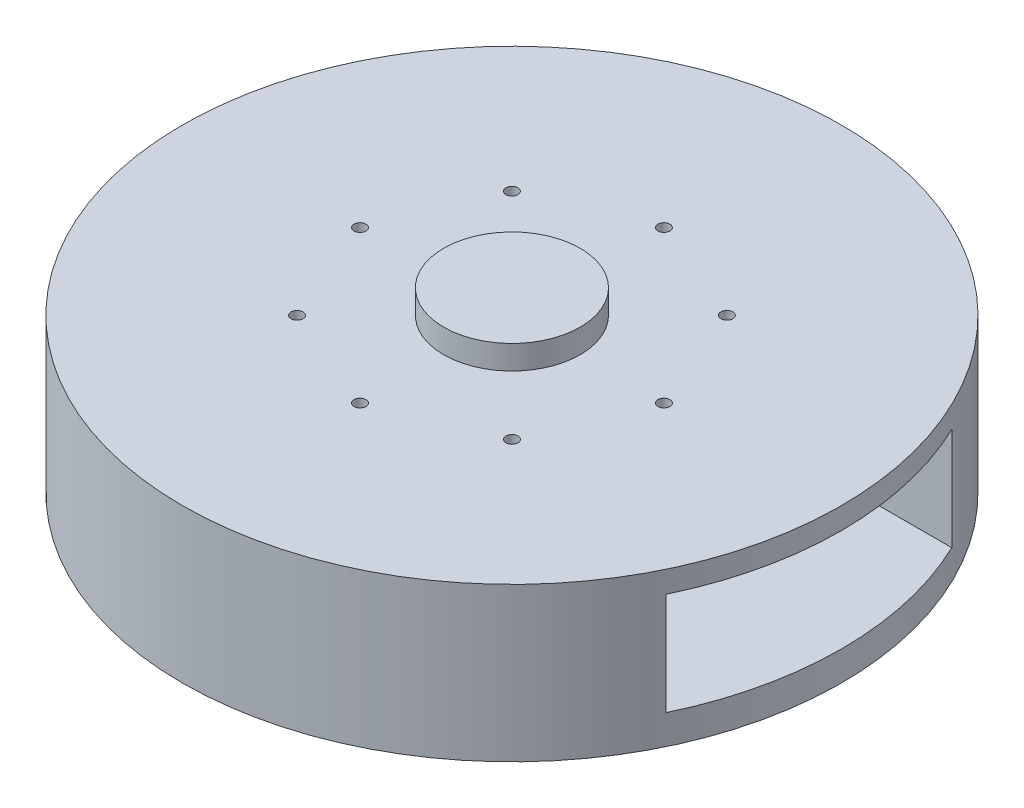
ISO-10303-21;
HEADER;
FILE_DESCRIPTION(('STEP AP214'),'2;1');
FILE_NAME('part.step','',(''),(''),'','','');
FILE_SCHEMA(('AUTOMOTIVE_DESIGN { 1 0 10303 214 1 1 1 1 }'));
ENDSEC;
DATA;
#1=APPLICATION_CONTEXT('core data for automotive mechanical design processes');
#2=APPLICATION_PROTOCOL_DEFINITION('international standard','automotive_design',2000,#1);
#3=PRODUCT_CONTEXT('',#1,'mechanical');
#4=PRODUCT('Part','Part','',(#3));
#5=PRODUCT_RELATED_PRODUCT_CATEGORY('part','',(#4));
#6=PRODUCT_DEFINITION_FORMATION('','',#4);
#7=PRODUCT_DEFINITION_CONTEXT('part definition',#1,'design');
#8=PRODUCT_DEFINITION('design','',#6,#7);
#9=PRODUCT_DEFINITION_SHAPE('','',#8);
#10=(LENGTH_UNIT() NAMED_UNIT(*) SI_UNIT(.MILLI.,.METRE.));
#11=(NAMED_UNIT(*) PLANE_ANGLE_UNIT() SI_UNIT($,.RADIAN.));
#12=(NAMED_UNIT(*) SI_UNIT($,.STERADIAN.) SOLID_ANGLE_UNIT());
#13=UNCERTAINTY_MEASURE_WITH_UNIT(LENGTH_MEASURE(1.E-05),#10,'distance_accuracy_value','');
#14=(GEOMETRIC_REPRESENTATION_CONTEXT(3) GLOBAL_UNCERTAINTY_ASSIGNED_CONTEXT((#13)) GLOBAL_UNIT_ASSIGNED_CONTEXT((#10,
#11,#12)) REPRESENTATION_CONTEXT('',''));
#15=CARTESIAN_POINT('',(0.,0.,0.));
#16=DIRECTION('',(0.,0.,1.));
#17=DIRECTION('',(1.,0.,0.));
#18=AXIS2_PLACEMENT_3D('',#15,#16,#17);
#19=CARTESIAN_POINT('',(0.,45.,0.));
#20=DIRECTION('',(0.,-1.,0.));
#21=DIRECTION('',(0.,0.,-1.));
#22=AXIS2_PLACEMENT_3D('',#19,#20,#21);
#23=CYLINDRICAL_SURFACE('',#22,96.5);
#24=CARTESIAN_POINT('',(0.,8.6519840390032,0.));
#25=DIRECTION('',(0.,-1.,0.));
#26=DIRECTION('',(0.,0.,-1.));
#27=AXIS2_PLACEMENT_3D('',#24,#25,#26);
#28=CIRCLE('',#27,96.5);
#29=CARTESIAN_POINT('',(86.9721419574417,8.65198403900322,-41.8102442391169));
#30=VERTEX_POINT('',#29);
#31=CARTESIAN_POINT('',(86.9721419574417,8.65198403900318,41.8102442391169));
#32=VERTEX_POINT('',#31);
#33=EDGE_CURVE('E110',#30,#32,#28,.T.);
#34=ORIENTED_EDGE('',*,*,#33,.T.);
#35=DIRECTION('',(0.,-1.,0.));
#36=VECTOR('',#35,1.);
#37=CARTESIAN_POINT('',(86.9721419574417,45.,41.8102442391169));
#38=LINE('',#37,#36);
#39=CARTESIAN_POINT('',(86.9721419574417,38.6519840390032,41.8102442391169));
#40=VERTEX_POINT('',#39);
#41=EDGE_CURVE('E126',#32,#40,#38,.F.);
#42=ORIENTED_EDGE('',*,*,#41,.T.);
#43=CARTESIAN_POINT('',(0.,38.6519840390032,0.));
#44=DIRECTION('',(0.,1.,0.));
#45=DIRECTION('',(0.,0.,1.));
#46=AXIS2_PLACEMENT_3D('',#43,#44,#45);
#47=CIRCLE('',#46,96.5);
#48=CARTESIAN_POINT('',(86.9721419574417,38.6519840390032,-41.8102442391169));
#49=VERTEX_POINT('',#48);
#50=EDGE_CURVE('E132',#40,#49,#47,.T.);
#51=ORIENTED_EDGE('',*,*,#50,.T.);
#52=DIRECTION('',(0.,-1.,0.));
#53=VECTOR('',#52,1.);
#54=CARTESIAN_POINT('',(86.9721419574417,45.,-41.8102442391169));
#55=LINE('',#54,#53);
#56=EDGE_CURVE('E178',#49,#30,#55,.T.);
#57=ORIENTED_EDGE('',*,*,#56,.T.);
#58=EDGE_LOOP('',(#34,#42,#51,#57));
#59=FACE_BOUND('',#58,.T.);
#60=CARTESIAN_POINT('',(-86.9721419574417,38.6519840390032,-41.8102442391169));
#61=VERTEX_POINT('',#60);
#62=CARTESIAN_POINT('',(-86.9721419574417,38.6519840390032,41.8102442391169));
#63=VERTEX_POINT('',#62);
#64=EDGE_CURVE('E124',#61,#63,#47,.T.);
#65=ORIENTED_EDGE('',*,*,#64,.T.);
#66=DIRECTION('',(0.,-1.,0.));
#67=VECTOR('',#66,1.);
#68=CARTESIAN_POINT('',(-86.9721419574417,45.,41.8102442391169));
#69=LINE('',#68,#67);
#70=CARTESIAN_POINT('',(-86.9721419574417,8.65198403900318,41.8102442391169));
#71=VERTEX_POINT('',#70);
#72=EDGE_CURVE('E116',#63,#71,#69,.T.);
#73=ORIENTED_EDGE('',*,*,#72,.T.);
#74=CARTESIAN_POINT('',(-86.9721419574417,8.65198403900322,-41.8102442391169));
#75=VERTEX_POINT('',#74);
#76=EDGE_CURVE('E102',#71,#75,#28,.T.);
#77=ORIENTED_EDGE('',*,*,#76,.T.);
#78=DIRECTION('',(0.,-1.,0.));
#79=VECTOR('',#78,1.);
#80=CARTESIAN_POINT('',(-86.9721419574417,45.,-41.8102442391169));
#81=LINE('',#80,#79);
#82=EDGE_CURVE('E167',#75,#61,#81,.F.);
#83=ORIENTED_EDGE('',*,*,#82,.T.);
#84=EDGE_LOOP('',(#65,#73,#77,#83));
#85=FACE_BOUND('',#84,.T.);
#86=CARTESIAN_POINT('',(0.,45.,0.));
#87=DIRECTION('',(0.,1.,0.));
#88=DIRECTION('',(0.,0.,1.));
#89=AXIS2_PLACEMENT_3D('',#86,#87,#88);
#90=CIRCLE('',#89,96.5);
#91=CARTESIAN_POINT('',(0.,45.,96.5));
#92=VERTEX_POINT('',#91);
#93=EDGE_CURVE('E139',#92,#92,#90,.T.);
#94=ORIENTED_EDGE('',*,*,#93,.F.);
#95=EDGE_LOOP('',(#94));
#96=FACE_BOUND('',#95,.T.);
#97=CARTESIAN_POINT('',(0.,0.,0.));
#98=DIRECTION('',(0.,1.,0.));
#99=DIRECTION('',(0.,0.,1.));
#100=AXIS2_PLACEMENT_3D('',#97,#98,#99);
#101=CIRCLE('',#100,96.5);
#102=CARTESIAN_POINT('',(0.,0.,96.5));
#103=VERTEX_POINT('',#102);
#104=EDGE_CURVE('E137',#103,#103,#101,.T.);
#105=ORIENTED_EDGE('',*,*,#104,.T.);
#106=EDGE_LOOP('',(#105));
#107=FACE_BOUND('',#106,.T.);
#108=ADVANCED_FACE('F39',(#59,#85,#96,#107),#23,.T.);
#109=CARTESIAN_POINT('',(0.,45.,0.));
#110=DIRECTION('',(0.,1.,0.));
#111=DIRECTION('',(0.,0.,1.));
#112=AXIS2_PLACEMENT_3D('',#109,#110,#111);
#113=PLANE('',#112);
#114=CARTESIAN_POINT('',(0.,45.,44.5));
#115=DIRECTION('',(0.,1.,0.));
#116=DIRECTION('',(0.,0.,1.));
#117=AXIS2_PLACEMENT_3D('',#114,#115,#116);
#118=CIRCLE('',#117,1.75);
#119=CARTESIAN_POINT('',(0.,45.,46.25));
#120=VERTEX_POINT('',#119);
#121=EDGE_CURVE('E194',#120,#120,#118,.T.);
#122=ORIENTED_EDGE('',*,*,#121,.F.);
#123=EDGE_LOOP('',(#122));
#124=FACE_BOUND('',#123,.T.);
#125=CARTESIAN_POINT('',(31.4662517628014,45.,31.4662517628013));
#126=DIRECTION('',(0.,1.,0.));
#127=DIRECTION('',(0.,0.,1.));
#128=AXIS2_PLACEMENT_3D('',#125,#126,#127);
#129=CIRCLE('',#128,1.75);
#130=CARTESIAN_POINT('',(31.4662517628014,45.,33.2162517628013));
#131=VERTEX_POINT('',#130);
#132=EDGE_CURVE('E197',#131,#131,#129,.T.);
#133=ORIENTED_EDGE('',*,*,#132,.F.);
#134=EDGE_LOOP('',(#133));
#135=FACE_BOUND('',#134,.T.);
#136=CARTESIAN_POINT('',(44.5,45.,-1.55370919578519E-13));
#137=DIRECTION('',(0.,1.,0.));
#138=DIRECTION('',(0.,0.,1.));
#139=AXIS2_PLACEMENT_3D('',#136,#137,#138);
#140=CIRCLE('',#139,1.75);
#141=CARTESIAN_POINT('',(44.5,45.,1.74999999999984));
#142=VERTEX_POINT('',#141);
#143=EDGE_CURVE('E200',#142,#142,#140,.T.);
#144=ORIENTED_EDGE('',*,*,#143,.F.);
#145=EDGE_LOOP('',(#144));
#146=FACE_BOUND('',#145,.T.);
#147=CARTESIAN_POINT('',(31.4662517628012,45.,-31.4662517628015));
#148=DIRECTION('',(0.,1.,0.));
#149=DIRECTION('',(0.,0.,1.));
#150=AXIS2_PLACEMENT_3D('',#147,#148,#149);
#151=CIRCLE('',#150,1.75);
#152=CARTESIAN_POINT('',(31.4662517628012,45.,-29.7162517628015));
#153=VERTEX_POINT('',#152);
#154=EDGE_CURVE('E203',#153,#153,#151,.T.);
#155=ORIENTED_EDGE('',*,*,#154,.F.);
#156=EDGE_LOOP('',(#155));
#157=FACE_BOUND('',#156,.T.);
#158=CARTESIAN_POINT('',(-3.10741839157039E-13,45.,-44.5));
#159=DIRECTION('',(0.,1.,0.));
#160=DIRECTION('',(0.,0.,1.));
#161=AXIS2_PLACEMENT_3D('',#158,#159,#160);
#162=CIRCLE('',#161,1.75);
#163=CARTESIAN_POINT('',(-3.10741839157039E-13,45.,-42.75));
#164=VERTEX_POINT('',#163);
#165=EDGE_CURVE('E206',#164,#164,#162,.T.);
#166=ORIENTED_EDGE('',*,*,#165,.F.);
#167=EDGE_LOOP('',(#166));
#168=FACE_BOUND('',#167,.T.);
#169=CARTESIAN_POINT('',(-31.4662517628016,45.,-31.4662517628011));
#170=DIRECTION('',(0.,1.,0.));
#171=DIRECTION('',(0.,0.,1.));
#172=AXIS2_PLACEMENT_3D('',#169,#170,#171);
#173=CIRCLE('',#172,1.75);
#174=CARTESIAN_POINT('',(-31.4662517628016,45.,-29.7162517628011));
#175=VERTEX_POINT('',#174);
#176=EDGE_CURVE('E209',#175,#175,#173,.T.);
#177=ORIENTED_EDGE('',*,*,#176,.F.);
#178=EDGE_LOOP('',(#177));
#179=FACE_BOUND('',#178,.T.);
#180=CARTESIAN_POINT('',(-44.5,45.,4.66112758735558E-13));
#181=DIRECTION('',(0.,1.,0.));
#182=DIRECTION('',(0.,0.,1.));
#183=AXIS2_PLACEMENT_3D('',#180,#181,#182);
#184=CIRCLE('',#183,1.75);
#185=CARTESIAN_POINT('',(-44.5,45.,1.75000000000047));
#186=VERTEX_POINT('',#185);
#187=EDGE_CURVE('E212',#186,#186,#184,.T.);
#188=ORIENTED_EDGE('',*,*,#187,.F.);
#189=EDGE_LOOP('',(#188));
#190=FACE_BOUND('',#189,.T.);
#191=CARTESIAN_POINT('',(-31.466251762801,45.,31.4662517628018));
#192=DIRECTION('',(0.,1.,0.));
#193=DIRECTION('',(0.,0.,1.));
#194=AXIS2_PLACEMENT_3D('',#191,#192,#193);
#195=CIRCLE('',#194,1.75);
#196=CARTESIAN_POINT('',(-31.466251762801,45.,33.2162517628018));
#197=VERTEX_POINT('',#196);
#198=EDGE_CURVE('E215',#197,#197,#195,.T.);
#199=ORIENTED_EDGE('',*,*,#198,.F.);
#200=EDGE_LOOP('',(#199));
#201=FACE_BOUND('',#200,.T.);
#202=CARTESIAN_POINT('',(0.,45.,0.));
#203=DIRECTION('',(0.,1.,0.));
#204=DIRECTION('',(0.,0.,1.));
#205=AXIS2_PLACEMENT_3D('',#202,#203,#204);
#206=CIRCLE('',#205,20.);
#207=CARTESIAN_POINT('',(0.,45.,20.));
#208=VERTEX_POINT('',#207);
#209=EDGE_CURVE('E11',#208,#208,#206,.T.);
#210=ORIENTED_EDGE('',*,*,#209,.F.);
#211=EDGE_LOOP('',(#210));
#212=FACE_BOUND('',#211,.T.);
#213=ORIENTED_EDGE('',*,*,#93,.T.);
#214=EDGE_LOOP('',(#213));
#215=FACE_BOUND('',#214,.T.);
#216=ADVANCED_FACE('F274',(#124,#135,#146,#157,#168,#179,#190,#201,#212,#215),#113,.T.);
#217=CARTESIAN_POINT('',(0.,0.,0.));
#218=DIRECTION('',(0.,1.,0.));
#219=DIRECTION('',(0.,0.,1.));
#220=AXIS2_PLACEMENT_3D('',#217,#218,#219);
#221=PLANE('',#220);
#222=CARTESIAN_POINT('',(0.,0.,0.));
#223=DIRECTION('',(0.,-1.,0.));
#224=DIRECTION('',(0.,0.,-1.));
#225=AXIS2_PLACEMENT_3D('',#222,#223,#224);
#226=CIRCLE('',#225,48.25);
#227=CARTESIAN_POINT('',(0.,0.,-48.25));
#228=VERTEX_POINT('',#227);
#229=EDGE_CURVE('E125',#228,#228,#226,.T.);
#230=ORIENTED_EDGE('',*,*,#229,.F.);
#231=EDGE_LOOP('',(#230));
#232=FACE_BOUND('',#231,.T.);
#233=ORIENTED_EDGE('',*,*,#104,.F.);
#234=EDGE_LOOP('',(#233));
#235=FACE_BOUND('',#234,.T.);
#236=ADVANCED_FACE('F268',(#232,#235),#221,.F.);
#237=CARTESIAN_POINT('',(0.,42.3,0.));
#238=DIRECTION('',(0.,-1.,0.));
#239=DIRECTION('',(0.,0.,-1.));
#240=AXIS2_PLACEMENT_3D('',#237,#238,#239);
#241=CYLINDRICAL_SURFACE('',#240,48.25);
#242=CARTESIAN_POINT('',(0.,8.6519840390032,0.));
#243=DIRECTION('',(0.,-1.,0.));
#244=DIRECTION('',(0.,0.,-1.));
#245=AXIS2_PLACEMENT_3D('',#242,#243,#244);
#246=CIRCLE('',#245,48.25);
#247=CARTESIAN_POINT('',(-24.082482776188,8.65198403900322,-41.8102442391169));
#248=VERTEX_POINT('',#247);
#249=CARTESIAN_POINT('',(-24.082482776188,8.65198403900318,41.8102442391169));
#250=VERTEX_POINT('',#249);
#251=EDGE_CURVE('E148',#248,#250,#246,.F.);
#252=ORIENTED_EDGE('',*,*,#251,.T.);
#253=DIRECTION('',(0.,-1.,0.));
#254=VECTOR('',#253,1.);
#255=CARTESIAN_POINT('',(-24.082482776188,42.3,41.8102442391169));
#256=LINE('',#255,#254);
#257=CARTESIAN_POINT('',(-24.082482776188,38.6519840390032,41.8102442391169));
#258=VERTEX_POINT('',#257);
#259=EDGE_CURVE('E42',#250,#258,#256,.F.);
#260=ORIENTED_EDGE('',*,*,#259,.T.);
#261=CARTESIAN_POINT('',(0.,38.6519840390032,0.));
#262=DIRECTION('',(0.,1.,0.));
#263=DIRECTION('',(0.,0.,1.));
#264=AXIS2_PLACEMENT_3D('',#261,#262,#263);
#265=CIRCLE('',#264,48.25);
#266=CARTESIAN_POINT('',(-24.082482776188,38.6519840390032,-41.8102442391169));
#267=VERTEX_POINT('',#266);
#268=EDGE_CURVE('E155',#258,#267,#265,.F.);
#269=ORIENTED_EDGE('',*,*,#268,.T.);
#270=DIRECTION('',(0.,-1.,0.));
#271=VECTOR('',#270,1.);
#272=CARTESIAN_POINT('',(-24.082482776188,42.3,-41.8102442391169));
#273=LINE('',#272,#271);
#274=EDGE_CURVE('E157',#267,#248,#273,.T.);
#275=ORIENTED_EDGE('',*,*,#274,.T.);
#276=EDGE_LOOP('',(#252,#260,#269,#275));
#277=FACE_BOUND('',#276,.T.);
#278=CARTESIAN_POINT('',(24.082482776188,38.6519840390032,-41.8102442391169));
#279=VERTEX_POINT('',#278);
#280=CARTESIAN_POINT('',(24.082482776188,38.6519840390032,41.8102442391169));
#281=VERTEX_POINT('',#280);
#282=EDGE_CURVE('E151',#279,#281,#265,.F.);
#283=ORIENTED_EDGE('',*,*,#282,.T.);
#284=DIRECTION('',(0.,-1.,0.));
#285=VECTOR('',#284,1.);
#286=CARTESIAN_POINT('',(24.082482776188,42.3,41.8102442391169));
#287=LINE('',#286,#285);
#288=CARTESIAN_POINT('',(24.082482776188,8.65198403900318,41.8102442391169));
#289=VERTEX_POINT('',#288);
#290=EDGE_CURVE('E154',#281,#289,#287,.T.);
#291=ORIENTED_EDGE('',*,*,#290,.T.);
#292=CARTESIAN_POINT('',(24.082482776188,8.65198403900322,-41.8102442391169));
#293=VERTEX_POINT('',#292);
#294=EDGE_CURVE('E142',#289,#293,#246,.F.);
#295=ORIENTED_EDGE('',*,*,#294,.T.);
#296=DIRECTION('',(0.,-1.,0.));
#297=VECTOR('',#296,1.);
#298=CARTESIAN_POINT('',(24.082482776188,42.3,-41.8102442391169));
#299=LINE('',#298,#297);
#300=EDGE_CURVE('E147',#293,#279,#299,.F.);
#301=ORIENTED_EDGE('',*,*,#300,.T.);
#302=EDGE_LOOP('',(#283,#291,#295,#301));
#303=FACE_BOUND('',#302,.T.);
#304=CARTESIAN_POINT('',(0.,42.3,0.));
#305=DIRECTION('',(0.,-1.,0.));
#306=DIRECTION('',(0.,0.,-1.));
#307=AXIS2_PLACEMENT_3D('',#304,#305,#306);
#308=CIRCLE('',#307,48.25);
#309=CARTESIAN_POINT('',(0.,42.3,-48.25));
#310=VERTEX_POINT('',#309);
#311=EDGE_CURVE('E129',#310,#310,#308,.T.);
#312=ORIENTED_EDGE('',*,*,#311,.F.);
#313=EDGE_LOOP('',(#312));
#314=FACE_BOUND('',#313,.T.);
#315=ORIENTED_EDGE('',*,*,#229,.T.);
#316=EDGE_LOOP('',(#315));
#317=FACE_BOUND('',#316,.T.);
#318=ADVANCED_FACE('F161',(#277,#303,#314,#317),#241,.F.);
#319=CARTESIAN_POINT('',(0.,42.3,0.));
#320=DIRECTION('',(0.,-1.,0.));
#321=DIRECTION('',(0.,0.,-1.));
#322=AXIS2_PLACEMENT_3D('',#319,#320,#321);
#323=PLANE('',#322);
#324=CARTESIAN_POINT('',(0.,42.3,44.5));
#325=DIRECTION('',(0.,-1.,0.));
#326=DIRECTION('',(0.,0.,-1.));
#327=AXIS2_PLACEMENT_3D('',#324,#325,#326);
#328=CIRCLE('',#327,1.75);
#329=CARTESIAN_POINT('',(0.,42.3,42.75));
#330=VERTEX_POINT('',#329);
#331=EDGE_CURVE('E218',#330,#330,#328,.T.);
#332=ORIENTED_EDGE('',*,*,#331,.F.);
#333=EDGE_LOOP('',(#332));
#334=FACE_BOUND('',#333,.T.);
#335=CARTESIAN_POINT('',(31.4662517628014,42.3,31.4662517628013));
#336=DIRECTION('',(0.,-1.,0.));
#337=DIRECTION('',(0.,0.,-1.));
#338=AXIS2_PLACEMENT_3D('',#335,#336,#337);
#339=CIRCLE('',#338,1.75);
#340=CARTESIAN_POINT('',(31.4662517628014,42.3,29.7162517628013));
#341=VERTEX_POINT('',#340);
#342=EDGE_CURVE('E237',#341,#341,#339,.T.);
#343=ORIENTED_EDGE('',*,*,#342,.F.);
#344=EDGE_LOOP('',(#343));
#345=FACE_BOUND('',#344,.T.);
#346=CARTESIAN_POINT('',(44.5,42.3,-1.55370919578519E-13));
#347=DIRECTION('',(0.,-1.,0.));
#348=DIRECTION('',(0.,0.,-1.));
#349=AXIS2_PLACEMENT_3D('',#346,#347,#348);
#350=CIRCLE('',#349,1.75);
#351=CARTESIAN_POINT('',(44.5,42.3,-1.75000000000016));
#352=VERTEX_POINT('',#351);
#353=EDGE_CURVE('E234',#352,#352,#350,.T.);
#354=ORIENTED_EDGE('',*,*,#353,.F.);
#355=EDGE_LOOP('',(#354));
#356=FACE_BOUND('',#355,.T.);
#357=CARTESIAN_POINT('',(31.4662517628012,42.3,-31.4662517628015));
#358=DIRECTION('',(0.,-1.,0.));
#359=DIRECTION('',(0.,0.,-1.));
#360=AXIS2_PLACEMENT_3D('',#357,#358,#359);
#361=CIRCLE('',#360,1.75);
#362=CARTESIAN_POINT('',(31.4662517628012,42.3,-33.2162517628015));
#363=VERTEX_POINT('',#362);
#364=EDGE_CURVE('E231',#363,#363,#361,.T.);
#365=ORIENTED_EDGE('',*,*,#364,.F.);
#366=EDGE_LOOP('',(#365));
#367=FACE_BOUND('',#366,.T.);
#368=CARTESIAN_POINT('',(-3.10741839157039E-13,42.3,-44.5));
#369=DIRECTION('',(0.,-1.,0.));
#370=DIRECTION('',(0.,0.,-1.));
#371=AXIS2_PLACEMENT_3D('',#368,#369,#370);
#372=CIRCLE('',#371,1.75);
#373=CARTESIAN_POINT('',(-3.10741839157039E-13,42.3,-46.25));
#374=VERTEX_POINT('',#373);
#375=EDGE_CURVE('E228',#374,#374,#372,.T.);
#376=ORIENTED_EDGE('',*,*,#375,.F.);
#377=EDGE_LOOP('',(#376));
#378=FACE_BOUND('',#377,.T.);
#379=CARTESIAN_POINT('',(-31.4662517628016,42.3,-31.4662517628011));
#380=DIRECTION('',(0.,-1.,0.));
#381=DIRECTION('',(0.,0.,-1.));
#382=AXIS2_PLACEMENT_3D('',#379,#380,#381);
#383=CIRCLE('',#382,1.75);
#384=CARTESIAN_POINT('',(-31.4662517628016,42.3,-33.2162517628011));
#385=VERTEX_POINT('',#384);
#386=EDGE_CURVE('E225',#385,#385,#383,.T.);
#387=ORIENTED_EDGE('',*,*,#386,.F.);
#388=EDGE_LOOP('',(#387));
#389=FACE_BOUND('',#388,.T.);
#390=CARTESIAN_POINT('',(-44.5,42.3,4.66112758735558E-13));
#391=DIRECTION('',(0.,-1.,0.));
#392=DIRECTION('',(0.,0.,-1.));
#393=AXIS2_PLACEMENT_3D('',#390,#391,#392);
#394=CIRCLE('',#393,1.75);
#395=CARTESIAN_POINT('',(-44.5,42.3,-1.74999999999953));
#396=VERTEX_POINT('',#395);
#397=EDGE_CURVE('E222',#396,#396,#394,.T.);
#398=ORIENTED_EDGE('',*,*,#397,.F.);
#399=EDGE_LOOP('',(#398));
#400=FACE_BOUND('',#399,.T.);
#401=CARTESIAN_POINT('',(-31.466251762801,42.3,31.4662517628018));
#402=DIRECTION('',(0.,-1.,0.));
#403=DIRECTION('',(0.,0.,-1.));
#404=AXIS2_PLACEMENT_3D('',#401,#402,#403);
#405=CIRCLE('',#404,1.75);
#406=CARTESIAN_POINT('',(-31.466251762801,42.3,29.7162517628018));
#407=VERTEX_POINT('',#406);
#408=EDGE_CURVE('E219',#407,#407,#405,.T.);
#409=ORIENTED_EDGE('',*,*,#408,.F.);
#410=EDGE_LOOP('',(#409));
#411=FACE_BOUND('',#410,.T.);
#412=ORIENTED_EDGE('',*,*,#311,.T.);
#413=EDGE_LOOP('',(#412));
#414=FACE_BOUND('',#413,.T.);
#415=ADVANCED_FACE('F245',(#334,#345,#356,#367,#378,#389,#400,#411,#414),#323,.T.);
#416=CARTESIAN_POINT('',(-500.,8.65198403900322,-41.8102442391169));
#417=DIRECTION('',(0.,-1.,0.));
#418=DIRECTION('',(0.,0.,-1.));
#419=AXIS2_PLACEMENT_3D('',#416,#417,#418);
#420=PLANE('',#419);
#421=DIRECTION('',(1.,0.,0.));
#422=VECTOR('',#421,1.);
#423=CARTESIAN_POINT('',(-500.,8.65198403900322,-41.8102442391169));
#424=LINE('',#423,#422);
#425=EDGE_CURVE('E120',#293,#30,#424,.T.);
#426=ORIENTED_EDGE('',*,*,#425,.F.);
#427=ORIENTED_EDGE('',*,*,#294,.F.);
#428=DIRECTION('',(1.,0.,0.));
#429=VECTOR('',#428,1.);
#430=CARTESIAN_POINT('',(-500.,8.65198403900318,41.8102442391169));
#431=LINE('',#430,#429);
#432=EDGE_CURVE('E54',#289,#32,#431,.T.);
#433=ORIENTED_EDGE('',*,*,#432,.T.);
#434=ORIENTED_EDGE('',*,*,#33,.F.);
#435=EDGE_LOOP('',(#426,#427,#433,#434));
#436=FACE_BOUND('',#435,.T.);
#437=ADVANCED_FACE('F248',(#436),#420,.F.);
#438=CARTESIAN_POINT('',(-500.,38.6519840390032,-41.8102442391169));
#439=DIRECTION('',(0.,0.,-1.));
#440=DIRECTION('',(0.,1.,0.));
#441=AXIS2_PLACEMENT_3D('',#438,#439,#440);
#442=PLANE('',#441);
#443=DIRECTION('',(1.,0.,0.));
#444=VECTOR('',#443,1.);
#445=CARTESIAN_POINT('',(-500.,38.6519840390032,-41.8102442391169));
#446=LINE('',#445,#444);
#447=EDGE_CURVE('E168',#279,#49,#446,.T.);
#448=ORIENTED_EDGE('',*,*,#447,.F.);
#449=ORIENTED_EDGE('',*,*,#300,.F.);
#450=ORIENTED_EDGE('',*,*,#425,.T.);
#451=ORIENTED_EDGE('',*,*,#56,.F.);
#452=EDGE_LOOP('',(#448,#449,#450,#451));
#453=FACE_BOUND('',#452,.T.);
#454=ADVANCED_FACE('F293',(#453),#442,.F.);
#455=CARTESIAN_POINT('',(-500.,38.6519840390032,-41.8102442391169));
#456=DIRECTION('',(0.,1.,0.));
#457=DIRECTION('',(0.,0.,1.));
#458=AXIS2_PLACEMENT_3D('',#455,#456,#457);
#459=PLANE('',#458);
#460=DIRECTION('',(1.,0.,0.));
#461=VECTOR('',#460,1.);
#462=CARTESIAN_POINT('',(-500.,38.6519840390032,41.8102442391169));
#463=LINE('',#462,#461);
#464=EDGE_CURVE('E187',#281,#40,#463,.T.);
#465=ORIENTED_EDGE('',*,*,#464,.F.);
#466=ORIENTED_EDGE('',*,*,#282,.F.);
#467=ORIENTED_EDGE('',*,*,#447,.T.);
#468=ORIENTED_EDGE('',*,*,#50,.F.);
#469=EDGE_LOOP('',(#465,#466,#467,#468));
#470=FACE_BOUND('',#469,.T.);
#471=ADVANCED_FACE('F186',(#470),#459,.F.);
#472=CARTESIAN_POINT('',(-500.,38.6519840390032,41.8102442391169));
#473=DIRECTION('',(0.,0.,1.));
#474=DIRECTION('',(0.,-1.,0.));
#475=AXIS2_PLACEMENT_3D('',#472,#473,#474);
#476=PLANE('',#475);
#477=ORIENTED_EDGE('',*,*,#432,.F.);
#478=ORIENTED_EDGE('',*,*,#290,.F.);
#479=ORIENTED_EDGE('',*,*,#464,.T.);
#480=ORIENTED_EDGE('',*,*,#41,.F.);
#481=EDGE_LOOP('',(#477,#478,#479,#480));
#482=FACE_BOUND('',#481,.T.);
#483=ADVANCED_FACE('F190',(#482),#476,.F.);
#484=EDGE_CURVE('E111',#63,#258,#463,.T.);
#485=ORIENTED_EDGE('',*,*,#484,.T.);
#486=ORIENTED_EDGE('',*,*,#259,.F.);
#487=EDGE_CURVE('E105',#71,#250,#431,.T.);
#488=ORIENTED_EDGE('',*,*,#487,.F.);
#489=ORIENTED_EDGE('',*,*,#72,.F.);
#490=EDGE_LOOP('',(#485,#486,#488,#489));
#491=FACE_BOUND('',#490,.T.);
#492=ADVANCED_FACE('F115',(#491),#476,.F.);
#493=EDGE_CURVE('E171',#61,#267,#446,.T.);
#494=ORIENTED_EDGE('',*,*,#493,.T.);
#495=ORIENTED_EDGE('',*,*,#268,.F.);
#496=ORIENTED_EDGE('',*,*,#484,.F.);
#497=ORIENTED_EDGE('',*,*,#64,.F.);
#498=EDGE_LOOP('',(#494,#495,#496,#497));
#499=FACE_BOUND('',#498,.T.);
#500=ADVANCED_FACE('F290',(#499),#459,.F.);
#501=EDGE_CURVE('E62',#75,#248,#424,.T.);
#502=ORIENTED_EDGE('',*,*,#501,.T.);
#503=ORIENTED_EDGE('',*,*,#274,.F.);
#504=ORIENTED_EDGE('',*,*,#493,.F.);
#505=ORIENTED_EDGE('',*,*,#82,.F.);
#506=EDGE_LOOP('',(#502,#503,#504,#505));
#507=FACE_BOUND('',#506,.T.);
#508=ADVANCED_FACE('F164',(#507),#442,.F.);
#509=ORIENTED_EDGE('',*,*,#487,.T.);
#510=ORIENTED_EDGE('',*,*,#251,.F.);
#511=ORIENTED_EDGE('',*,*,#501,.F.);
#512=ORIENTED_EDGE('',*,*,#76,.F.);
#513=EDGE_LOOP('',(#509,#510,#511,#512));
#514=FACE_BOUND('',#513,.T.);
#515=ADVANCED_FACE('F104',(#514),#420,.F.);
#516=CARTESIAN_POINT('',(0.,52.,0.));
#517=DIRECTION('',(0.,-1.,0.));
#518=DIRECTION('',(0.,0.,-1.));
#519=AXIS2_PLACEMENT_3D('',#516,#517,#518);
#520=CYLINDRICAL_SURFACE('',#519,20.);
#521=CARTESIAN_POINT('',(0.,52.,0.));
#522=DIRECTION('',(0.,1.,0.));
#523=DIRECTION('',(0.,0.,1.));
#524=AXIS2_PLACEMENT_3D('',#521,#522,#523);
#525=CIRCLE('',#524,20.);
#526=CARTESIAN_POINT('',(0.,52.,20.));
#527=VERTEX_POINT('',#526);
#528=EDGE_CURVE('E175',#527,#527,#525,.T.);
#529=ORIENTED_EDGE('',*,*,#528,.F.);
#530=EDGE_LOOP('',(#529));
#531=FACE_BOUND('',#530,.T.);
#532=ORIENTED_EDGE('',*,*,#209,.T.);
#533=EDGE_LOOP('',(#532));
#534=FACE_BOUND('',#533,.T.);
#535=ADVANCED_FACE('F299',(#531,#534),#520,.T.);
#536=CARTESIAN_POINT('',(0.,52.,0.));
#537=DIRECTION('',(0.,1.,0.));
#538=DIRECTION('',(0.,0.,1.));
#539=AXIS2_PLACEMENT_3D('',#536,#537,#538);
#540=PLANE('',#539);
#541=ORIENTED_EDGE('',*,*,#528,.T.);
#542=EDGE_LOOP('',(#541));
#543=FACE_BOUND('',#542,.T.);
#544=ADVANCED_FACE('F302',(#543),#540,.T.);
#545=CARTESIAN_POINT('',(-31.466251762801,52.,31.4662517628018));
#546=DIRECTION('',(0.,-1.,0.));
#547=DIRECTION('',(0.,0.,-1.));
#548=AXIS2_PLACEMENT_3D('',#545,#546,#547);
#549=CYLINDRICAL_SURFACE('',#548,1.75);
#550=ORIENTED_EDGE('',*,*,#198,.T.);
#551=EDGE_LOOP('',(#550));
#552=FACE_BOUND('',#551,.T.);
#553=ORIENTED_EDGE('',*,*,#408,.T.);
#554=EDGE_LOOP('',(#553));
#555=FACE_BOUND('',#554,.T.);
#556=ADVANCED_FACE('F306',(#552,#555),#549,.F.);
#557=CARTESIAN_POINT('',(-44.5,52.,4.66112758735558E-13));
#558=DIRECTION('',(0.,-1.,0.));
#559=DIRECTION('',(0.,0.,-1.));
#560=AXIS2_PLACEMENT_3D('',#557,#558,#559);
#561=CYLINDRICAL_SURFACE('',#560,1.75);
#562=ORIENTED_EDGE('',*,*,#187,.T.);
#563=EDGE_LOOP('',(#562));
#564=FACE_BOUND('',#563,.T.);
#565=ORIENTED_EDGE('',*,*,#397,.T.);
#566=EDGE_LOOP('',(#565));
#567=FACE_BOUND('',#566,.T.);
#568=ADVANCED_FACE('F310',(#564,#567),#561,.F.);
#569=CARTESIAN_POINT('',(-31.4662517628016,52.,-31.4662517628011));
#570=DIRECTION('',(0.,-1.,0.));
#571=DIRECTION('',(0.,0.,-1.));
#572=AXIS2_PLACEMENT_3D('',#569,#570,#571);
#573=CYLINDRICAL_SURFACE('',#572,1.75);
#574=ORIENTED_EDGE('',*,*,#176,.T.);
#575=EDGE_LOOP('',(#574));
#576=FACE_BOUND('',#575,.T.);
#577=ORIENTED_EDGE('',*,*,#386,.T.);
#578=EDGE_LOOP('',(#577));
#579=FACE_BOUND('',#578,.T.);
#580=ADVANCED_FACE('F314',(#576,#579),#573,.F.);
#581=CARTESIAN_POINT('',(-3.10741839157039E-13,52.,-44.5));
#582=DIRECTION('',(0.,-1.,0.));
#583=DIRECTION('',(0.,0.,-1.));
#584=AXIS2_PLACEMENT_3D('',#581,#582,#583);
#585=CYLINDRICAL_SURFACE('',#584,1.75);
#586=ORIENTED_EDGE('',*,*,#165,.T.);
#587=EDGE_LOOP('',(#586));
#588=FACE_BOUND('',#587,.T.);
#589=ORIENTED_EDGE('',*,*,#375,.T.);
#590=EDGE_LOOP('',(#589));
#591=FACE_BOUND('',#590,.T.);
#592=ADVANCED_FACE('F318',(#588,#591),#585,.F.);
#593=CARTESIAN_POINT('',(31.4662517628012,52.,-31.4662517628015));
#594=DIRECTION('',(0.,-1.,0.));
#595=DIRECTION('',(0.,0.,-1.));
#596=AXIS2_PLACEMENT_3D('',#593,#594,#595);
#597=CYLINDRICAL_SURFACE('',#596,1.75);
#598=ORIENTED_EDGE('',*,*,#154,.T.);
#599=EDGE_LOOP('',(#598));
#600=FACE_BOUND('',#599,.T.);
#601=ORIENTED_EDGE('',*,*,#364,.T.);
#602=EDGE_LOOP('',(#601));
#603=FACE_BOUND('',#602,.T.);
#604=ADVANCED_FACE('F322',(#600,#603),#597,.F.);
#605=CARTESIAN_POINT('',(44.5,52.,-1.55370919578519E-13));
#606=DIRECTION('',(0.,-1.,0.));
#607=DIRECTION('',(0.,0.,-1.));
#608=AXIS2_PLACEMENT_3D('',#605,#606,#607);
#609=CYLINDRICAL_SURFACE('',#608,1.75);
#610=ORIENTED_EDGE('',*,*,#143,.T.);
#611=EDGE_LOOP('',(#610));
#612=FACE_BOUND('',#611,.T.);
#613=ORIENTED_EDGE('',*,*,#353,.T.);
#614=EDGE_LOOP('',(#613));
#615=FACE_BOUND('',#614,.T.);
#616=ADVANCED_FACE('F326',(#612,#615),#609,.F.);
#617=CARTESIAN_POINT('',(31.4662517628014,52.,31.4662517628013));
#618=DIRECTION('',(0.,-1.,0.));
#619=DIRECTION('',(0.,0.,-1.));
#620=AXIS2_PLACEMENT_3D('',#617,#618,#619);
#621=CYLINDRICAL_SURFACE('',#620,1.75);
#622=ORIENTED_EDGE('',*,*,#132,.T.);
#623=EDGE_LOOP('',(#622));
#624=FACE_BOUND('',#623,.T.);
#625=ORIENTED_EDGE('',*,*,#342,.T.);
#626=EDGE_LOOP('',(#625));
#627=FACE_BOUND('',#626,.T.);
#628=ADVANCED_FACE('F330',(#624,#627),#621,.F.);
#629=CARTESIAN_POINT('',(0.,52.,44.5));
#630=DIRECTION('',(0.,-1.,0.));
#631=DIRECTION('',(0.,0.,-1.));
#632=AXIS2_PLACEMENT_3D('',#629,#630,#631);
#633=CYLINDRICAL_SURFACE('',#632,1.75);
#634=ORIENTED_EDGE('',*,*,#121,.T.);
#635=EDGE_LOOP('',(#634));
#636=FACE_BOUND('',#635,.T.);
#637=ORIENTED_EDGE('',*,*,#331,.T.);
#638=EDGE_LOOP('',(#637));
#639=FACE_BOUND('',#638,.T.);
#640=ADVANCED_FACE('F243',(#636,#639),#633,.F.);
#641=CLOSED_SHELL('',(#108,#216,#236,#318,#415,#437,#454,#471,#483,#492,#500,#508,#515,#535,
#544,#556,#568,#580,#592,#604,#616,#628,#640));
#642=MANIFOLD_SOLID_BREP('B2',#641);
#643=ADVANCED_BREP_SHAPE_REPRESENTATION('',(#18,#642),#14);
#644=SHAPE_DEFINITION_REPRESENTATION(#9,#643);
ENDSEC;
END-ISO-10303-21;
